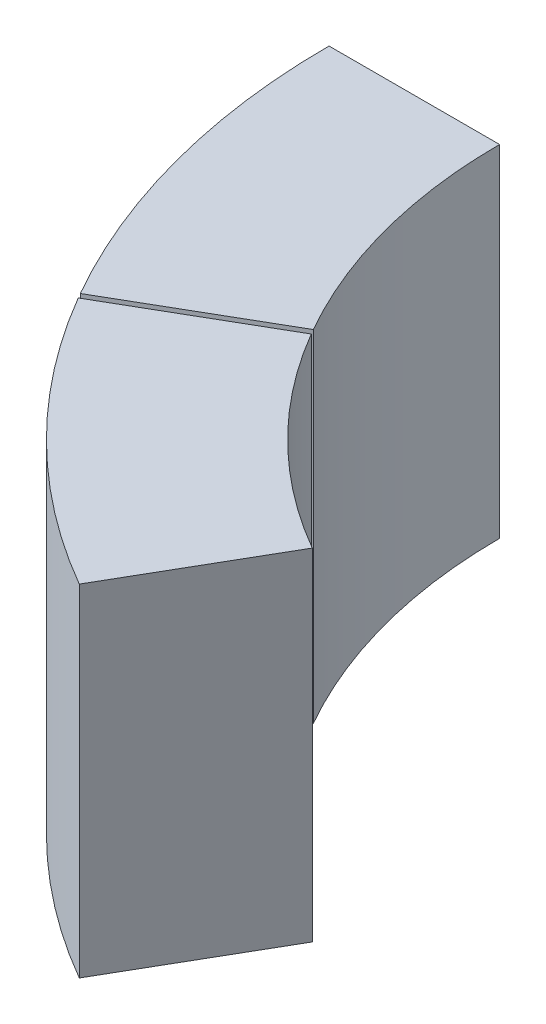
ISO-10303-21;
HEADER;
FILE_DESCRIPTION(('STEP AP214'),'2;1');
FILE_NAME('part.step','',(''),(''),'','','');
FILE_SCHEMA(('AUTOMOTIVE_DESIGN { 1 0 10303 214 1 1 1 1 }'));
ENDSEC;
DATA;
#1=APPLICATION_CONTEXT('core data for automotive mechanical design processes');
#2=APPLICATION_PROTOCOL_DEFINITION('international standard','automotive_design',2000,#1);
#3=PRODUCT_CONTEXT('',#1,'mechanical');
#4=PRODUCT('Part','Part','',(#3));
#5=PRODUCT_RELATED_PRODUCT_CATEGORY('part','',(#4));
#6=PRODUCT_DEFINITION_FORMATION('','',#4);
#7=PRODUCT_DEFINITION_CONTEXT('part definition',#1,'design');
#8=PRODUCT_DEFINITION('design','',#6,#7);
#9=PRODUCT_DEFINITION_SHAPE('','',#8);
#10=(LENGTH_UNIT() NAMED_UNIT(*) SI_UNIT(.MILLI.,.METRE.));
#11=(NAMED_UNIT(*) PLANE_ANGLE_UNIT() SI_UNIT($,.RADIAN.));
#12=(NAMED_UNIT(*) SI_UNIT($,.STERADIAN.) SOLID_ANGLE_UNIT());
#13=UNCERTAINTY_MEASURE_WITH_UNIT(LENGTH_MEASURE(1.E-05),#10,'distance_accuracy_value','');
#14=(GEOMETRIC_REPRESENTATION_CONTEXT(3) GLOBAL_UNCERTAINTY_ASSIGNED_CONTEXT((#13)) GLOBAL_UNIT_ASSIGNED_CONTEXT((#10,
#11,#12)) REPRESENTATION_CONTEXT('',''));
#15=CARTESIAN_POINT('',(0.,0.,0.));
#16=DIRECTION('',(0.,0.,1.));
#17=DIRECTION('',(1.,0.,0.));
#18=AXIS2_PLACEMENT_3D('',#15,#16,#17);
#19=CARTESIAN_POINT('',(0.,600.,0.));
#20=DIRECTION('',(0.,1.,0.));
#21=DIRECTION('',(0.,0.,1.));
#22=AXIS2_PLACEMENT_3D('',#19,#20,#21);
#23=PLANE('',#22);
#24=DIRECTION('',(0.866025403784438,0.,-0.500000000000002));
#25=VECTOR('',#24,1.);
#26=CARTESIAN_POINT('',(-41.4069616942971,600.,29.679823172423));
#27=LINE('',#26,#25);
#28=CARTESIAN_POINT('',(-1036.72146340422,600.,604.324918662985));
#29=VERTEX_POINT('',#28);
#30=CARTESIAN_POINT('',(-776.910835182576,600.,454.323182520895));
#31=VERTEX_POINT('',#30);
#32=EDGE_CURVE('E11',#29,#31,#27,.T.);
#33=ORIENTED_EDGE('',*,*,#32,.F.);
#34=CARTESIAN_POINT('',(0.,600.,0.));
#35=DIRECTION('',(0.,1.,0.));
#36=DIRECTION('',(0.,0.,1.));
#37=AXIS2_PLACEMENT_3D('',#34,#35,#36);
#38=CIRCLE('',#37,1200.);
#39=CARTESIAN_POINT('',(-599.999999999997,600.,1039.23048454133));
#40=VERTEX_POINT('',#39);
#41=EDGE_CURVE('E351',#29,#40,#38,.T.);
#42=ORIENTED_EDGE('',*,*,#41,.T.);
#43=DIRECTION('',(-0.499999999999998,0.,0.86602540378444));
#44=VECTOR('',#43,1.);
#45=CARTESIAN_POINT('',(0.,600.,0.));
#46=LINE('',#45,#44);
#47=CARTESIAN_POINT('',(-449.999999999998,600.,779.422863405996));
#48=VERTEX_POINT('',#47);
#49=EDGE_CURVE('E331',#48,#40,#46,.T.);
#50=ORIENTED_EDGE('',*,*,#49,.F.);
#51=CARTESIAN_POINT('',(0.,600.,0.));
#52=DIRECTION('',(0.,1.,0.));
#53=DIRECTION('',(0.,0.,1.));
#54=AXIS2_PLACEMENT_3D('',#51,#52,#53);
#55=CIRCLE('',#54,900.);
#56=EDGE_CURVE('E311',#31,#48,#55,.T.);
#57=ORIENTED_EDGE('',*,*,#56,.F.);
#58=EDGE_LOOP('',(#33,#42,#50,#57));
#59=FACE_BOUND('',#58,.T.);
#60=ADVANCED_FACE('F42',(#59),#23,.T.);
#61=CARTESIAN_POINT('',(0.,600.,0.));
#62=DIRECTION('',(0.,1.,0.));
#63=DIRECTION('',(0.,0.,1.));
#64=AXIS2_PLACEMENT_3D('',#61,#62,#63);
#65=PLANE('',#64);
#66=DIRECTION('',(-0.866025403784438,0.,0.500000000000002));
#67=VECTOR('',#66,1.);
#68=CARTESIAN_POINT('',(-57.7959078736684,600.,27.5949802770249));
#69=LINE('',#68,#67);
#70=CARTESIAN_POINT('',(-781.910835182575,600.,445.66292848305));
#71=VERTEX_POINT('',#70);
#72=CARTESIAN_POINT('',(-1041.72146340422,600.,595.664664625141));
#73=VERTEX_POINT('',#72);
#74=EDGE_CURVE('E239',#71,#73,#69,.T.);
#75=ORIENTED_EDGE('',*,*,#74,.F.);
#76=CARTESIAN_POINT('',(0.,600.,0.));
#77=DIRECTION('',(0.,1.,0.));
#78=DIRECTION('',(0.,0.,1.));
#79=AXIS2_PLACEMENT_3D('',#76,#77,#78);
#80=CIRCLE('',#79,900.);
#81=CARTESIAN_POINT('',(-900.,600.,0.));
#82=VERTEX_POINT('',#81);
#83=EDGE_CURVE('E251',#82,#71,#80,.T.);
#84=ORIENTED_EDGE('',*,*,#83,.F.);
#85=DIRECTION('',(-1.,0.,0.));
#86=VECTOR('',#85,1.);
#87=CARTESIAN_POINT('',(0.,600.,0.));
#88=LINE('',#87,#86);
#89=CARTESIAN_POINT('',(-1200.,600.,0.));
#90=VERTEX_POINT('',#89);
#91=EDGE_CURVE('E255',#82,#90,#88,.T.);
#92=ORIENTED_EDGE('',*,*,#91,.T.);
#93=CARTESIAN_POINT('',(0.,600.,0.));
#94=DIRECTION('',(0.,1.,0.));
#95=DIRECTION('',(0.,0.,1.));
#96=AXIS2_PLACEMENT_3D('',#93,#94,#95);
#97=CIRCLE('',#96,1200.);
#98=EDGE_CURVE('E259',#90,#73,#97,.T.);
#99=ORIENTED_EDGE('',*,*,#98,.T.);
#100=EDGE_LOOP('',(#75,#84,#92,#99));
#101=FACE_BOUND('',#100,.T.);
#102=ADVANCED_FACE('F611',(#101),#65,.T.);
#103=CARTESIAN_POINT('',(0.,600.,0.));
#104=DIRECTION('',(0.,-1.,0.));
#105=DIRECTION('',(0.,0.,-1.));
#106=AXIS2_PLACEMENT_3D('',#103,#104,#105);
#107=CYLINDRICAL_SURFACE('',#106,900.);
#108=DIRECTION('',(0.,-1.,0.));
#109=VECTOR('',#108,1.);
#110=CARTESIAN_POINT('',(-776.910835182575,600.,454.323182520894));
#111=LINE('',#110,#109);
#112=CARTESIAN_POINT('',(-776.910835182575,0.,454.323182520895));
#113=VERTEX_POINT('',#112);
#114=EDGE_CURVE('E53',#31,#113,#111,.T.);
#115=ORIENTED_EDGE('',*,*,#114,.F.);
#116=ORIENTED_EDGE('',*,*,#56,.T.);
#117=DIRECTION('',(0.,-1.,0.));
#118=VECTOR('',#117,1.);
#119=CARTESIAN_POINT('',(-449.999999999998,600.,779.422863405996));
#120=LINE('',#119,#118);
#121=CARTESIAN_POINT('',(-449.999999999998,0.,779.422863405996));
#122=VERTEX_POINT('',#121);
#123=EDGE_CURVE('E332',#48,#122,#120,.T.);
#124=ORIENTED_EDGE('',*,*,#123,.T.);
#125=CARTESIAN_POINT('',(0.,0.,0.));
#126=DIRECTION('',(0.,1.,0.));
#127=DIRECTION('',(0.,0.,1.));
#128=AXIS2_PLACEMENT_3D('',#125,#126,#127);
#129=CIRCLE('',#128,900.);
#130=EDGE_CURVE('E46',#113,#122,#129,.T.);
#131=ORIENTED_EDGE('',*,*,#130,.F.);
#132=EDGE_LOOP('',(#115,#116,#124,#131));
#133=FACE_BOUND('',#132,.T.);
#134=ADVANCED_FACE('F44',(#133),#107,.F.);
#135=CARTESIAN_POINT('',(0.,600.,0.));
#136=DIRECTION('',(0.,-1.,0.));
#137=DIRECTION('',(0.,0.,-1.));
#138=AXIS2_PLACEMENT_3D('',#135,#136,#137);
#139=CYLINDRICAL_SURFACE('',#138,1200.);
#140=ORIENTED_EDGE('',*,*,#41,.F.);
#141=DIRECTION('',(0.,-1.,0.));
#142=VECTOR('',#141,1.);
#143=CARTESIAN_POINT('',(-1036.72146340422,600.,604.324918662985));
#144=LINE('',#143,#142);
#145=CARTESIAN_POINT('',(-1036.72146340422,0.,604.324918662985));
#146=VERTEX_POINT('',#145);
#147=EDGE_CURVE('E336',#29,#146,#144,.T.);
#148=ORIENTED_EDGE('',*,*,#147,.T.);
#149=CARTESIAN_POINT('',(0.,0.,0.));
#150=DIRECTION('',(0.,1.,0.));
#151=DIRECTION('',(0.,0.,1.));
#152=AXIS2_PLACEMENT_3D('',#149,#150,#151);
#153=CIRCLE('',#152,1200.);
#154=CARTESIAN_POINT('',(-599.999999999997,0.,1039.23048454133));
#155=VERTEX_POINT('',#154);
#156=EDGE_CURVE('E349',#146,#155,#153,.T.);
#157=ORIENTED_EDGE('',*,*,#156,.T.);
#158=DIRECTION('',(0.,-1.,0.));
#159=VECTOR('',#158,1.);
#160=CARTESIAN_POINT('',(-599.999999999997,600.,1039.23048454133));
#161=LINE('',#160,#159);
#162=EDGE_CURVE('E327',#40,#155,#161,.T.);
#163=ORIENTED_EDGE('',*,*,#162,.F.);
#164=EDGE_LOOP('',(#140,#148,#157,#163));
#165=FACE_BOUND('',#164,.T.);
#166=ADVANCED_FACE('F360',(#165),#139,.T.);
#167=CARTESIAN_POINT('',(0.,0.,0.));
#168=DIRECTION('',(0.,1.,0.));
#169=DIRECTION('',(0.,0.,1.));
#170=AXIS2_PLACEMENT_3D('',#167,#168,#169);
#171=PLANE('',#170);
#172=ORIENTED_EDGE('',*,*,#156,.F.);
#173=DIRECTION('',(0.866025403784438,0.,-0.500000000000002));
#174=VECTOR('',#173,1.);
#175=CARTESIAN_POINT('',(2.49999999999987,0.,4.33012701892194));
#176=LINE('',#175,#174);
#177=CARTESIAN_POINT('',(-993.420193214994,0.,579.324918662984));
#178=VERTEX_POINT('',#177);
#179=EDGE_CURVE('E322',#146,#178,#176,.T.);
#180=ORIENTED_EDGE('',*,*,#179,.T.);
#181=CARTESIAN_POINT('',(0.,0.,0.));
#182=DIRECTION('',(0.,-1.,0.));
#183=DIRECTION('',(0.,0.,1.));
#184=AXIS2_PLACEMENT_3D('',#181,#182,#183);
#185=CIRCLE('',#184,1150.00045290043);
#186=CARTESIAN_POINT('',(-998.420193214993,0.,570.664664625141));
#187=VERTEX_POINT('',#186);
#188=EDGE_CURVE('E290',#178,#187,#185,.T.);
#189=ORIENTED_EDGE('',*,*,#188,.T.);
#190=DIRECTION('',(-0.866025403784438,0.,0.500000000000002));
#191=VECTOR('',#190,1.);
#192=CARTESIAN_POINT('',(-2.50000000000012,0.,-4.33012701892238));
#193=LINE('',#192,#191);
#194=CARTESIAN_POINT('',(-1041.72146340422,0.,595.664664625141));
#195=VERTEX_POINT('',#194);
#196=EDGE_CURVE('E279',#187,#195,#193,.T.);
#197=ORIENTED_EDGE('',*,*,#196,.T.);
#198=CARTESIAN_POINT('',(0.,0.,0.));
#199=DIRECTION('',(0.,1.,0.));
#200=DIRECTION('',(0.,0.,1.));
#201=AXIS2_PLACEMENT_3D('',#198,#199,#200);
#202=CIRCLE('',#201,1200.);
#203=CARTESIAN_POINT('',(-1200.,0.,0.));
#204=VERTEX_POINT('',#203);
#205=EDGE_CURVE('E256',#204,#195,#202,.T.);
#206=ORIENTED_EDGE('',*,*,#205,.F.);
#207=DIRECTION('',(-1.,0.,0.));
#208=VECTOR('',#207,1.);
#209=CARTESIAN_POINT('',(0.,0.,0.));
#210=LINE('',#209,#208);
#211=CARTESIAN_POINT('',(-900.,0.,0.));
#212=VERTEX_POINT('',#211);
#213=EDGE_CURVE('E267',#212,#204,#210,.T.);
#214=ORIENTED_EDGE('',*,*,#213,.F.);
#215=CARTESIAN_POINT('',(0.,0.,0.));
#216=DIRECTION('',(0.,1.,0.));
#217=DIRECTION('',(0.,0.,1.));
#218=AXIS2_PLACEMENT_3D('',#215,#216,#217);
#219=CIRCLE('',#218,900.);
#220=CARTESIAN_POINT('',(-781.910835182575,0.,445.66292848305));
#221=VERTEX_POINT('',#220);
#222=EDGE_CURVE('E250',#212,#221,#219,.T.);
#223=ORIENTED_EDGE('',*,*,#222,.T.);
#224=CARTESIAN_POINT('',(-825.212105371797,0.,470.66292848305));
#225=VERTEX_POINT('',#224);
#226=EDGE_CURVE('E280',#221,#225,#193,.T.);
#227=ORIENTED_EDGE('',*,*,#226,.T.);
#228=CARTESIAN_POINT('',(0.,0.,0.));
#229=DIRECTION('',(0.,1.,0.));
#230=DIRECTION('',(0.,0.,1.));
#231=AXIS2_PLACEMENT_3D('',#228,#229,#230);
#232=CIRCLE('',#231,949.999268999926);
#233=CARTESIAN_POINT('',(-820.212105371797,0.,479.323182520895));
#234=VERTEX_POINT('',#233);
#235=EDGE_CURVE('E284',#225,#234,#232,.T.);
#236=ORIENTED_EDGE('',*,*,#235,.T.);
#237=EDGE_CURVE('E326',#234,#113,#176,.T.);
#238=ORIENTED_EDGE('',*,*,#237,.T.);
#239=ORIENTED_EDGE('',*,*,#130,.T.);
#240=DIRECTION('',(-0.499999999999998,0.,0.86602540378444));
#241=VECTOR('',#240,1.);
#242=CARTESIAN_POINT('',(0.,0.,0.));
#243=LINE('',#242,#241);
#244=EDGE_CURVE('E337',#122,#155,#243,.T.);
#245=ORIENTED_EDGE('',*,*,#244,.T.);
#246=EDGE_LOOP('',(#172,#180,#189,#197,#206,#214,#223,#227,#236,#238,#239,#245));
#247=FACE_BOUND('',#246,.T.);
#248=ADVANCED_FACE('F367',(#247),#171,.F.);
#249=CARTESIAN_POINT('',(0.,600.,0.));
#250=DIRECTION('',(0.86602540378444,0.,0.499999999999998));
#251=DIRECTION('',(0.499999999999998,0.,-0.86602540378444));
#252=AXIS2_PLACEMENT_3D('',#249,#250,#251);
#253=PLANE('',#252);
#254=ORIENTED_EDGE('',*,*,#244,.F.);
#255=ORIENTED_EDGE('',*,*,#123,.F.);
#256=ORIENTED_EDGE('',*,*,#49,.T.);
#257=ORIENTED_EDGE('',*,*,#162,.T.);
#258=EDGE_LOOP('',(#254,#255,#256,#257));
#259=FACE_BOUND('',#258,.T.);
#260=ADVANCED_FACE('F364',(#259),#253,.T.);
#261=CARTESIAN_POINT('',(-41.4069616942971,0.,29.679823172423));
#262=DIRECTION('',(0.500000000000002,0.,0.866025403784438));
#263=DIRECTION('',(0.866025403784438,0.,-0.500000000000002));
#264=AXIS2_PLACEMENT_3D('',#261,#262,#263);
#265=PLANE('',#264);
#266=ORIENTED_EDGE('',*,*,#237,.F.);
#267=DIRECTION('',(0.,-1.,0.));
#268=VECTOR('',#267,1.);
#269=CARTESIAN_POINT('',(-820.212105371797,100.,479.323182520895));
#270=LINE('',#269,#268);
#271=CARTESIAN_POINT('',(-820.212105371797,100.,479.323182520895));
#272=VERTEX_POINT('',#271);
#273=EDGE_CURVE('E301',#272,#234,#270,.T.);
#274=ORIENTED_EDGE('',*,*,#273,.F.);
#275=DIRECTION('',(-0.866025403784438,0.,0.500000000000001));
#276=VECTOR('',#275,1.);
#277=CARTESIAN_POINT('',(-820.212105371797,100.,479.323182520895));
#278=LINE('',#277,#276);
#279=CARTESIAN_POINT('',(-993.420193214994,100.,579.324918662984));
#280=VERTEX_POINT('',#279);
#281=EDGE_CURVE('E289',#272,#280,#278,.T.);
#282=ORIENTED_EDGE('',*,*,#281,.T.);
#283=DIRECTION('',(0.,-1.,0.));
#284=VECTOR('',#283,1.);
#285=CARTESIAN_POINT('',(-993.420193214994,100.,579.324918662984));
#286=LINE('',#285,#284);
#287=EDGE_CURVE('E315',#280,#178,#286,.T.);
#288=ORIENTED_EDGE('',*,*,#287,.T.);
#289=ORIENTED_EDGE('',*,*,#179,.F.);
#290=ORIENTED_EDGE('',*,*,#147,.F.);
#291=ORIENTED_EDGE('',*,*,#32,.T.);
#292=ORIENTED_EDGE('',*,*,#114,.T.);
#293=EDGE_LOOP('',(#266,#274,#282,#288,#289,#290,#291,#292));
#294=FACE_BOUND('',#293,.T.);
#295=ADVANCED_FACE('F377',(#294),#265,.F.);
#296=CARTESIAN_POINT('',(0.,100.,0.));
#297=DIRECTION('',(0.,-1.,0.));
#298=DIRECTION('',(0.,0.,-1.));
#299=AXIS2_PLACEMENT_3D('',#296,#297,#298);
#300=CYLINDRICAL_SURFACE('',#299,949.999268999926);
#301=ORIENTED_EDGE('',*,*,#235,.F.);
#302=DIRECTION('',(0.,-1.,0.));
#303=VECTOR('',#302,1.);
#304=CARTESIAN_POINT('',(-825.212105371797,100.,470.66292848305));
#305=LINE('',#304,#303);
#306=CARTESIAN_POINT('',(-825.212105371797,100.,470.66292848305));
#307=VERTEX_POINT('',#306);
#308=EDGE_CURVE('E307',#307,#225,#305,.T.);
#309=ORIENTED_EDGE('',*,*,#308,.F.);
#310=CARTESIAN_POINT('',(0.,100.,0.));
#311=DIRECTION('',(0.,1.,0.));
#312=DIRECTION('',(0.,0.,1.));
#313=AXIS2_PLACEMENT_3D('',#310,#311,#312);
#314=CIRCLE('',#313,949.999268999926);
#315=EDGE_CURVE('E285',#307,#272,#314,.T.);
#316=ORIENTED_EDGE('',*,*,#315,.T.);
#317=ORIENTED_EDGE('',*,*,#273,.T.);
#318=EDGE_LOOP('',(#301,#309,#316,#317));
#319=FACE_BOUND('',#318,.T.);
#320=ADVANCED_FACE('F659',(#319),#300,.F.);
#321=CARTESIAN_POINT('',(0.,100.,0.));
#322=DIRECTION('',(0.,-1.,0.));
#323=DIRECTION('',(0.,0.,-1.));
#324=AXIS2_PLACEMENT_3D('',#321,#322,#323);
#325=CYLINDRICAL_SURFACE('',#324,1150.00045290043);
#326=ORIENTED_EDGE('',*,*,#188,.F.);
#327=ORIENTED_EDGE('',*,*,#287,.F.);
#328=CARTESIAN_POINT('',(0.,100.,0.));
#329=DIRECTION('',(0.,-1.,0.));
#330=DIRECTION('',(0.,0.,1.));
#331=AXIS2_PLACEMENT_3D('',#328,#329,#330);
#332=CIRCLE('',#331,1150.00045290043);
#333=CARTESIAN_POINT('',(-998.420193214993,100.,570.664664625141));
#334=VERTEX_POINT('',#333);
#335=EDGE_CURVE('E294',#280,#334,#332,.T.);
#336=ORIENTED_EDGE('',*,*,#335,.T.);
#337=DIRECTION('',(0.,-1.,0.));
#338=VECTOR('',#337,1.);
#339=CARTESIAN_POINT('',(-998.420193214993,100.,570.664664625141));
#340=LINE('',#339,#338);
#341=EDGE_CURVE('E312',#334,#187,#340,.T.);
#342=ORIENTED_EDGE('',*,*,#341,.T.);
#343=EDGE_LOOP('',(#326,#327,#336,#342));
#344=FACE_BOUND('',#343,.T.);
#345=ADVANCED_FACE('F666',(#344),#325,.T.);
#346=CARTESIAN_POINT('',(0.,100.,0.));
#347=DIRECTION('',(0.,1.,0.));
#348=DIRECTION('',(0.,0.,1.));
#349=AXIS2_PLACEMENT_3D('',#346,#347,#348);
#350=PLANE('',#349);
#351=ORIENTED_EDGE('',*,*,#315,.F.);
#352=DIRECTION('',(0.866025403784437,0.,-0.500000000000003));
#353=VECTOR('',#352,1.);
#354=CARTESIAN_POINT('',(-825.212105371797,100.,470.66292848305));
#355=LINE('',#354,#353);
#356=EDGE_CURVE('E297',#334,#307,#355,.T.);
#357=ORIENTED_EDGE('',*,*,#356,.F.);
#358=ORIENTED_EDGE('',*,*,#335,.F.);
#359=ORIENTED_EDGE('',*,*,#281,.F.);
#360=EDGE_LOOP('',(#351,#357,#358,#359));
#361=FACE_BOUND('',#360,.T.);
#362=ADVANCED_FACE('F674',(#361),#350,.T.);
#363=CARTESIAN_POINT('',(0.,600.,0.));
#364=DIRECTION('',(0.,0.,1.));
#365=DIRECTION('',(1.,0.,0.));
#366=AXIS2_PLACEMENT_3D('',#363,#364,#365);
#367=PLANE('',#366);
#368=ORIENTED_EDGE('',*,*,#213,.T.);
#369=DIRECTION('',(0.,-1.,0.));
#370=VECTOR('',#369,1.);
#371=CARTESIAN_POINT('',(-1200.,600.,0.));
#372=LINE('',#371,#370);
#373=EDGE_CURVE('E263',#90,#204,#372,.T.);
#374=ORIENTED_EDGE('',*,*,#373,.F.);
#375=ORIENTED_EDGE('',*,*,#91,.F.);
#376=DIRECTION('',(0.,-1.,0.));
#377=VECTOR('',#376,1.);
#378=CARTESIAN_POINT('',(-900.,600.,0.));
#379=LINE('',#378,#377);
#380=EDGE_CURVE('E276',#82,#212,#379,.T.);
#381=ORIENTED_EDGE('',*,*,#380,.T.);
#382=EDGE_LOOP('',(#368,#374,#375,#381));
#383=FACE_BOUND('',#382,.T.);
#384=ADVANCED_FACE('F681',(#383),#367,.F.);
#385=CARTESIAN_POINT('',(0.,600.,0.));
#386=DIRECTION('',(0.,-1.,0.));
#387=DIRECTION('',(0.,0.,-1.));
#388=AXIS2_PLACEMENT_3D('',#385,#386,#387);
#389=CYLINDRICAL_SURFACE('',#388,1200.);
#390=ORIENTED_EDGE('',*,*,#205,.T.);
#391=DIRECTION('',(0.,-1.,0.));
#392=VECTOR('',#391,1.);
#393=CARTESIAN_POINT('',(-1041.72146340422,600.,595.66466462514));
#394=LINE('',#393,#392);
#395=EDGE_CURVE('E242',#195,#73,#394,.F.);
#396=ORIENTED_EDGE('',*,*,#395,.T.);
#397=ORIENTED_EDGE('',*,*,#98,.F.);
#398=ORIENTED_EDGE('',*,*,#373,.T.);
#399=EDGE_LOOP('',(#390,#396,#397,#398));
#400=FACE_BOUND('',#399,.T.);
#401=ADVANCED_FACE('F688',(#400),#389,.T.);
#402=CARTESIAN_POINT('',(0.,600.,0.));
#403=DIRECTION('',(0.,-1.,0.));
#404=DIRECTION('',(0.,0.,-1.));
#405=AXIS2_PLACEMENT_3D('',#402,#403,#404);
#406=CYLINDRICAL_SURFACE('',#405,900.);
#407=DIRECTION('',(0.,-1.,0.));
#408=VECTOR('',#407,1.);
#409=CARTESIAN_POINT('',(-781.910835182575,600.,445.66292848305));
#410=LINE('',#409,#408);
#411=EDGE_CURVE('E247',#221,#71,#410,.F.);
#412=ORIENTED_EDGE('',*,*,#411,.F.);
#413=ORIENTED_EDGE('',*,*,#222,.F.);
#414=ORIENTED_EDGE('',*,*,#380,.F.);
#415=ORIENTED_EDGE('',*,*,#83,.T.);
#416=EDGE_LOOP('',(#412,#413,#414,#415));
#417=FACE_BOUND('',#416,.T.);
#418=ADVANCED_FACE('F696',(#417),#406,.F.);
#419=CARTESIAN_POINT('',(-57.7959078736684,0.,27.5949802770249));
#420=DIRECTION('',(-0.500000000000002,0.,-0.866025403784438));
#421=DIRECTION('',(-0.866025403784438,0.,0.500000000000002));
#422=AXIS2_PLACEMENT_3D('',#419,#420,#421);
#423=PLANE('',#422);
#424=ORIENTED_EDGE('',*,*,#308,.T.);
#425=ORIENTED_EDGE('',*,*,#226,.F.);
#426=ORIENTED_EDGE('',*,*,#411,.T.);
#427=ORIENTED_EDGE('',*,*,#74,.T.);
#428=ORIENTED_EDGE('',*,*,#395,.F.);
#429=ORIENTED_EDGE('',*,*,#196,.F.);
#430=ORIENTED_EDGE('',*,*,#341,.F.);
#431=ORIENTED_EDGE('',*,*,#356,.T.);
#432=EDGE_LOOP('',(#424,#425,#426,#427,#428,#429,#430,#431));
#433=FACE_BOUND('',#432,.T.);
#434=ADVANCED_FACE('F384',(#433),#423,.F.);
#435=CLOSED_SHELL('',(#60,#102,#134,#166,#248,#260,#295,#320,#345,#362,#384,#401,#418,#434));
#436=CARTESIAN_POINT('',(0.,590.,0.));
#437=DIRECTION('',(0.,1.,0.));
#438=DIRECTION('',(0.,0.,1.));
#439=AXIS2_PLACEMENT_3D('',#436,#437,#438);
#440=PLANE('',#439);
#441=CARTESIAN_POINT('',(0.,590.,0.));
#442=DIRECTION('',(0.,-1.,0.));
#443=DIRECTION('',(0.,0.,1.));
#444=AXIS2_PLACEMENT_3D('',#441,#442,#443);
#445=CIRCLE('',#444,910.);
#446=CARTESIAN_POINT('',(-463.632780680936,590.,783.035532193823));
#447=VERTEX_POINT('',#446);
#448=CARTESIAN_POINT('',(-780.47604659025,590.,467.928563670626));
#449=VERTEX_POINT('',#448);
#450=EDGE_CURVE('E491',#447,#449,#445,.T.);
#451=ORIENTED_EDGE('',*,*,#450,.F.);
#452=DIRECTION('',(0.499999999999998,0.,-0.86602540378444));
#453=VECTOR('',#452,1.);
#454=CARTESIAN_POINT('',(-463.632780680936,590.,783.035532193823));
#455=LINE('',#454,#453);
#456=CARTESIAN_POINT('',(-603.639245263582,590.,1025.53384223906));
#457=VERTEX_POINT('',#456);
#458=EDGE_CURVE('E467',#457,#447,#455,.T.);
#459=ORIENTED_EDGE('',*,*,#458,.F.);
#460=CARTESIAN_POINT('',(0.,590.,0.));
#461=DIRECTION('',(0.,1.,0.));
#462=DIRECTION('',(0.,0.,1.));
#463=AXIS2_PLACEMENT_3D('',#460,#461,#462);
#464=CIRCLE('',#463,1190.);
#465=CARTESIAN_POINT('',(-1022.9883551016,590.,607.943110271451));
#466=VERTEX_POINT('',#465);
#467=EDGE_CURVE('E69',#466,#457,#464,.T.);
#468=ORIENTED_EDGE('',*,*,#467,.F.);
#469=DIRECTION('',(-0.866025403784438,0.,0.500000000000002));
#470=VECTOR('',#469,1.);
#471=CARTESIAN_POINT('',(-1022.9883551016,590.,607.943110271451));
#472=LINE('',#471,#470);
#473=EDGE_CURVE('E476',#449,#466,#472,.T.);
#474=ORIENTED_EDGE('',*,*,#473,.F.);
#475=EDGE_LOOP('',(#451,#459,#468,#474));
#476=FACE_BOUND('',#475,.T.);
#477=ADVANCED_FACE('F534',(#476),#440,.F.);
#478=CARTESIAN_POINT('',(-36.4069616942971,0.,38.3400772102674));
#479=DIRECTION('',(0.500000000000002,0.,0.866025403784438));
#480=DIRECTION('',(0.866025403784438,0.,-0.500000000000002));
#481=AXIS2_PLACEMENT_3D('',#478,#479,#480);
#482=PLANE('',#481);
#483=DIRECTION('',(0.,-1.,0.));
#484=VECTOR('',#483,1.);
#485=CARTESIAN_POINT('',(-780.47604659025,600.,467.928563670626));
#486=LINE('',#485,#484);
#487=CARTESIAN_POINT('',(-780.47604659025,10.,467.928563670626));
#488=VERTEX_POINT('',#487);
#489=EDGE_CURVE('E243',#449,#488,#486,.T.);
#490=ORIENTED_EDGE('',*,*,#489,.F.);
#491=ORIENTED_EDGE('',*,*,#473,.T.);
#492=DIRECTION('',(0.,-1.,0.));
#493=VECTOR('',#492,1.);
#494=CARTESIAN_POINT('',(-1022.9883551016,600.,607.943110271451));
#495=LINE('',#494,#493);
#496=CARTESIAN_POINT('',(-1022.9883551016,10.,607.943110271451));
#497=VERTEX_POINT('',#496);
#498=EDGE_CURVE('E411',#466,#497,#495,.T.);
#499=ORIENTED_EDGE('',*,*,#498,.T.);
#500=DIRECTION('',(0.866025403784438,0.,-0.500000000000002));
#501=VECTOR('',#500,1.);
#502=CARTESIAN_POINT('',(7.49999999999988,10.,12.9903810567663));
#503=LINE('',#502,#501);
#504=CARTESIAN_POINT('',(-979.683885838846,10.,582.941263285487));
#505=VERTEX_POINT('',#504);
#506=EDGE_CURVE('E399',#497,#505,#503,.T.);
#507=ORIENTED_EDGE('',*,*,#506,.T.);
#508=DIRECTION('',(0.,-1.,0.));
#509=VECTOR('',#508,1.);
#510=CARTESIAN_POINT('',(-979.683885838846,90.,582.941263285487));
#511=LINE('',#510,#509);
#512=CARTESIAN_POINT('',(-979.683885838846,90.,582.941263285487));
#513=VERTEX_POINT('',#512);
#514=EDGE_CURVE('E424',#513,#505,#511,.T.);
#515=ORIENTED_EDGE('',*,*,#514,.F.);
#516=DIRECTION('',(-0.866025403784438,0.,0.500000000000002));
#517=VECTOR('',#516,1.);
#518=CARTESIAN_POINT('',(-36.4069616942971,90.,38.3400772102674));
#519=LINE('',#518,#517);
#520=CARTESIAN_POINT('',(-823.782260944075,90.,492.931418185391));
#521=VERTEX_POINT('',#520);
#522=EDGE_CURVE('E439',#521,#513,#519,.T.);
#523=ORIENTED_EDGE('',*,*,#522,.F.);
#524=DIRECTION('',(0.,-1.,0.));
#525=VECTOR('',#524,1.);
#526=CARTESIAN_POINT('',(-823.782260944075,90.,492.931418185391));
#527=LINE('',#526,#525);
#528=CARTESIAN_POINT('',(-823.782260944075,10.,492.931418185391));
#529=VERTEX_POINT('',#528);
#530=EDGE_CURVE('E428',#521,#529,#527,.T.);
#531=ORIENTED_EDGE('',*,*,#530,.T.);
#532=DIRECTION('',(0.866025403784438,0.,-0.500000000000002));
#533=VECTOR('',#532,1.);
#534=CARTESIAN_POINT('',(7.49999999999988,10.,12.9903810567663));
#535=LINE('',#534,#533);
#536=EDGE_CURVE('E403',#529,#488,#535,.T.);
#537=ORIENTED_EDGE('',*,*,#536,.T.);
#538=EDGE_LOOP('',(#490,#491,#499,#507,#515,#523,#531,#537));
#539=FACE_BOUND('',#538,.T.);
#540=ADVANCED_FACE('F502',(#539),#482,.T.);
#541=CARTESIAN_POINT('',(0.,600.,0.));
#542=DIRECTION('',(0.,-1.,0.));
#543=DIRECTION('',(0.,0.,-1.));
#544=AXIS2_PLACEMENT_3D('',#541,#542,#543);
#545=CYLINDRICAL_SURFACE('',#544,910.);
#546=ORIENTED_EDGE('',*,*,#450,.T.);
#547=ORIENTED_EDGE('',*,*,#489,.T.);
#548=CARTESIAN_POINT('',(0.,10.,0.));
#549=DIRECTION('',(0.,1.,0.));
#550=DIRECTION('',(0.,0.,1.));
#551=AXIS2_PLACEMENT_3D('',#548,#549,#550);
#552=CIRCLE('',#551,910.);
#553=CARTESIAN_POINT('',(-463.632780680936,10.,783.035532193823));
#554=VERTEX_POINT('',#553);
#555=EDGE_CURVE('E395',#488,#554,#552,.T.);
#556=ORIENTED_EDGE('',*,*,#555,.T.);
#557=DIRECTION('',(0.,-1.,0.));
#558=VECTOR('',#557,1.);
#559=CARTESIAN_POINT('',(-463.632780680936,600.,783.035532193823));
#560=LINE('',#559,#558);
#561=EDGE_CURVE('E414',#447,#554,#560,.T.);
#562=ORIENTED_EDGE('',*,*,#561,.F.);
#563=EDGE_LOOP('',(#546,#547,#556,#562));
#564=FACE_BOUND('',#563,.T.);
#565=ADVANCED_FACE('F511',(#564),#545,.T.);
#566=CARTESIAN_POINT('',(-8.6602540378444,600.,-4.99999999999998));
#567=DIRECTION('',(0.86602540378444,0.,0.499999999999998));
#568=DIRECTION('',(0.499999999999998,0.,-0.86602540378444));
#569=AXIS2_PLACEMENT_3D('',#566,#567,#568);
#570=PLANE('',#569);
#571=ORIENTED_EDGE('',*,*,#458,.T.);
#572=ORIENTED_EDGE('',*,*,#561,.T.);
#573=DIRECTION('',(-0.499999999999998,0.,0.86602540378444));
#574=VECTOR('',#573,1.);
#575=CARTESIAN_POINT('',(-8.6602540378444,10.,-4.99999999999998));
#576=LINE('',#575,#574);
#577=CARTESIAN_POINT('',(-603.639245263582,10.,1025.53384223906));
#578=VERTEX_POINT('',#577);
#579=EDGE_CURVE('E391',#554,#578,#576,.T.);
#580=ORIENTED_EDGE('',*,*,#579,.T.);
#581=DIRECTION('',(0.,-1.,0.));
#582=VECTOR('',#581,1.);
#583=CARTESIAN_POINT('',(-603.639245263582,600.,1025.53384223906));
#584=LINE('',#583,#582);
#585=EDGE_CURVE('E388',#457,#578,#584,.T.);
#586=ORIENTED_EDGE('',*,*,#585,.F.);
#587=EDGE_LOOP('',(#571,#572,#580,#586));
#588=FACE_BOUND('',#587,.T.);
#589=ADVANCED_FACE('F509',(#588),#570,.F.);
#590=CARTESIAN_POINT('',(0.,600.,0.));
#591=DIRECTION('',(0.,-1.,0.));
#592=DIRECTION('',(0.,0.,-1.));
#593=AXIS2_PLACEMENT_3D('',#590,#591,#592);
#594=CYLINDRICAL_SURFACE('',#593,1190.);
#595=ORIENTED_EDGE('',*,*,#498,.F.);
#596=ORIENTED_EDGE('',*,*,#467,.T.);
#597=ORIENTED_EDGE('',*,*,#585,.T.);
#598=CARTESIAN_POINT('',(0.,10.,0.));
#599=DIRECTION('',(0.,1.,0.));
#600=DIRECTION('',(0.,0.,1.));
#601=AXIS2_PLACEMENT_3D('',#598,#599,#600);
#602=CIRCLE('',#601,1190.);
#603=EDGE_CURVE('E407',#497,#578,#602,.T.);
#604=ORIENTED_EDGE('',*,*,#603,.F.);
#605=EDGE_LOOP('',(#595,#596,#597,#604));
#606=FACE_BOUND('',#605,.T.);
#607=ADVANCED_FACE('F506',(#606),#594,.F.);
#608=CARTESIAN_POINT('',(0.,100.,0.));
#609=DIRECTION('',(0.,-1.,0.));
#610=DIRECTION('',(0.,0.,-1.));
#611=AXIS2_PLACEMENT_3D('',#608,#609,#610);
#612=CYLINDRICAL_SURFACE('',#611,1140.00045290043);
#613=CARTESIAN_POINT('',(0.,9.99999999999999,0.));
#614=DIRECTION('',(0.,1.,0.));
#615=DIRECTION('',(0.,0.,1.));
#616=AXIS2_PLACEMENT_3D('',#613,#614,#615);
#617=CIRCLE('',#616,1140.00045290043);
#618=CARTESIAN_POINT('',(-994.683885838846,10.,556.960501171954));
#619=VERTEX_POINT('',#618);
#620=EDGE_CURVE('E447',#505,#619,#617,.F.);
#621=ORIENTED_EDGE('',*,*,#620,.T.);
#622=DIRECTION('',(0.,-1.,0.));
#623=VECTOR('',#622,1.);
#624=CARTESIAN_POINT('',(-994.683885838846,90.,556.960501171954));
#625=LINE('',#624,#623);
#626=CARTESIAN_POINT('',(-994.683885838846,90.,556.960501171954));
#627=VERTEX_POINT('',#626);
#628=EDGE_CURVE('E421',#627,#619,#625,.T.);
#629=ORIENTED_EDGE('',*,*,#628,.F.);
#630=CARTESIAN_POINT('',(0.,90.,0.));
#631=DIRECTION('',(0.,1.,0.));
#632=DIRECTION('',(0.,0.,1.));
#633=AXIS2_PLACEMENT_3D('',#630,#631,#632);
#634=CIRCLE('',#633,1140.00045290043);
#635=EDGE_CURVE('E436',#513,#627,#634,.F.);
#636=ORIENTED_EDGE('',*,*,#635,.F.);
#637=ORIENTED_EDGE('',*,*,#514,.T.);
#638=EDGE_LOOP('',(#621,#629,#636,#637));
#639=FACE_BOUND('',#638,.T.);
#640=ADVANCED_FACE('F521',(#639),#612,.F.);
#641=CARTESIAN_POINT('',(0.,90.,0.));
#642=DIRECTION('',(0.,1.,0.));
#643=DIRECTION('',(0.,0.,1.));
#644=AXIS2_PLACEMENT_3D('',#641,#642,#643);
#645=PLANE('',#644);
#646=CARTESIAN_POINT('',(0.,90.,0.));
#647=DIRECTION('',(0.,1.,0.));
#648=DIRECTION('',(0.,0.,1.));
#649=AXIS2_PLACEMENT_3D('',#646,#647,#648);
#650=CIRCLE('',#649,959.999268999926);
#651=CARTESIAN_POINT('',(-838.782260944075,90.,466.950656071858));
#652=VERTEX_POINT('',#651);
#653=EDGE_CURVE('E443',#652,#521,#650,.T.);
#654=ORIENTED_EDGE('',*,*,#653,.T.);
#655=ORIENTED_EDGE('',*,*,#522,.T.);
#656=ORIENTED_EDGE('',*,*,#635,.T.);
#657=DIRECTION('',(0.866025403784438,0.,-0.500000000000002));
#658=VECTOR('',#657,1.);
#659=CARTESIAN_POINT('',(-62.7959078736685,90.,18.9347262391805));
#660=LINE('',#659,#658);
#661=EDGE_CURVE('E432',#627,#652,#660,.T.);
#662=ORIENTED_EDGE('',*,*,#661,.T.);
#663=EDGE_LOOP('',(#654,#655,#656,#662));
#664=FACE_BOUND('',#663,.T.);
#665=ADVANCED_FACE('F518',(#664),#645,.F.);
#666=CARTESIAN_POINT('',(0.,100.,0.));
#667=DIRECTION('',(0.,-1.,0.));
#668=DIRECTION('',(0.,0.,-1.));
#669=AXIS2_PLACEMENT_3D('',#666,#667,#668);
#670=CYLINDRICAL_SURFACE('',#669,959.999268999926);
#671=CARTESIAN_POINT('',(0.,9.99999999999999,0.));
#672=DIRECTION('',(0.,1.,0.));
#673=DIRECTION('',(0.,0.,1.));
#674=AXIS2_PLACEMENT_3D('',#671,#672,#673);
#675=CIRCLE('',#674,959.999268999926);
#676=CARTESIAN_POINT('',(-838.782260944075,10.,466.950656071858));
#677=VERTEX_POINT('',#676);
#678=EDGE_CURVE('E451',#677,#529,#675,.T.);
#679=ORIENTED_EDGE('',*,*,#678,.T.);
#680=ORIENTED_EDGE('',*,*,#530,.F.);
#681=ORIENTED_EDGE('',*,*,#653,.F.);
#682=DIRECTION('',(0.,-1.,0.));
#683=VECTOR('',#682,1.);
#684=CARTESIAN_POINT('',(-838.782260944075,90.,466.950656071858));
#685=LINE('',#684,#683);
#686=EDGE_CURVE('E417',#652,#677,#685,.T.);
#687=ORIENTED_EDGE('',*,*,#686,.T.);
#688=EDGE_LOOP('',(#679,#680,#681,#687));
#689=FACE_BOUND('',#688,.T.);
#690=ADVANCED_FACE('F514',(#689),#670,.T.);
#691=CARTESIAN_POINT('',(0.,10.,0.));
#692=DIRECTION('',(0.,1.,0.));
#693=DIRECTION('',(0.,0.,1.));
#694=AXIS2_PLACEMENT_3D('',#691,#692,#693);
#695=PLANE('',#694);
#696=ORIENTED_EDGE('',*,*,#603,.T.);
#697=ORIENTED_EDGE('',*,*,#579,.F.);
#698=ORIENTED_EDGE('',*,*,#555,.F.);
#699=ORIENTED_EDGE('',*,*,#536,.F.);
#700=ORIENTED_EDGE('',*,*,#678,.F.);
#701=DIRECTION('',(-0.866025403784438,0.,0.500000000000002));
#702=VECTOR('',#701,1.);
#703=CARTESIAN_POINT('',(-7.50000000000014,10.,-12.9903810567668));
#704=LINE('',#703,#702);
#705=CARTESIAN_POINT('',(-795.47604659025,10.,441.947801557093));
#706=VERTEX_POINT('',#705);
#707=EDGE_CURVE('E233',#706,#677,#704,.T.);
#708=ORIENTED_EDGE('',*,*,#707,.F.);
#709=CARTESIAN_POINT('',(0.,10.,0.));
#710=DIRECTION('',(0.,1.,0.));
#711=DIRECTION('',(0.,0.,1.));
#712=AXIS2_PLACEMENT_3D('',#709,#710,#711);
#713=CIRCLE('',#712,910.);
#714=CARTESIAN_POINT('',(-909.945053286186,10.,10.));
#715=VERTEX_POINT('',#714);
#716=EDGE_CURVE('E460',#715,#706,#713,.T.);
#717=ORIENTED_EDGE('',*,*,#716,.F.);
#718=DIRECTION('',(-1.,0.,0.));
#719=VECTOR('',#718,1.);
#720=CARTESIAN_POINT('',(0.,10.,10.));
#721=LINE('',#720,#719);
#722=CARTESIAN_POINT('',(-1189.95798245148,10.,10.));
#723=VERTEX_POINT('',#722);
#724=EDGE_CURVE('E225',#715,#723,#721,.T.);
#725=ORIENTED_EDGE('',*,*,#724,.T.);
#726=CARTESIAN_POINT('',(0.,10.,0.));
#727=DIRECTION('',(0.,1.,0.));
#728=DIRECTION('',(0.,0.,1.));
#729=AXIS2_PLACEMENT_3D('',#726,#727,#728);
#730=CIRCLE('',#729,1190.);
#731=CARTESIAN_POINT('',(-1037.9883551016,10.,581.962348157918));
#732=VERTEX_POINT('',#731);
#733=EDGE_CURVE('E235',#723,#732,#730,.T.);
#734=ORIENTED_EDGE('',*,*,#733,.T.);
#735=DIRECTION('',(-0.866025403784438,0.,0.500000000000002));
#736=VECTOR('',#735,1.);
#737=CARTESIAN_POINT('',(-7.50000000000014,10.,-12.9903810567668));
#738=LINE('',#737,#736);
#739=EDGE_CURVE('E228',#619,#732,#738,.T.);
#740=ORIENTED_EDGE('',*,*,#739,.F.);
#741=ORIENTED_EDGE('',*,*,#620,.F.);
#742=ORIENTED_EDGE('',*,*,#506,.F.);
#743=EDGE_LOOP('',(#696,#697,#698,#699,#700,#708,#717,#725,#734,#740,#741,#742));
#744=FACE_BOUND('',#743,.T.);
#745=ADVANCED_FACE('F486',(#744),#695,.T.);
#746=CARTESIAN_POINT('',(-62.7959078736685,0.,18.9347262391805));
#747=DIRECTION('',(-0.500000000000002,0.,-0.866025403784438));
#748=DIRECTION('',(-0.866025403784438,0.,0.500000000000002));
#749=AXIS2_PLACEMENT_3D('',#746,#747,#748);
#750=PLANE('',#749);
#751=DIRECTION('',(0.,-1.,0.));
#752=VECTOR('',#751,1.);
#753=CARTESIAN_POINT('',(-1037.9883551016,10.,581.962348157918));
#754=LINE('',#753,#752);
#755=CARTESIAN_POINT('',(-1037.9883551016,590.,581.962348157918));
#756=VERTEX_POINT('',#755);
#757=EDGE_CURVE('E464',#732,#756,#754,.F.);
#758=ORIENTED_EDGE('',*,*,#757,.T.);
#759=DIRECTION('',(0.866025403784438,0.,-0.500000000000002));
#760=VECTOR('',#759,1.);
#761=CARTESIAN_POINT('',(-795.47604659025,590.,441.947801557093));
#762=LINE('',#761,#760);
#763=CARTESIAN_POINT('',(-795.47604659025,590.,441.947801557093));
#764=VERTEX_POINT('',#763);
#765=EDGE_CURVE('E489',#756,#764,#762,.T.);
#766=ORIENTED_EDGE('',*,*,#765,.T.);
#767=DIRECTION('',(0.,-1.,0.));
#768=VECTOR('',#767,1.);
#769=CARTESIAN_POINT('',(-795.47604659025,10.,441.947801557093));
#770=LINE('',#769,#768);
#771=EDGE_CURVE('E220',#706,#764,#770,.F.);
#772=ORIENTED_EDGE('',*,*,#771,.F.);
#773=ORIENTED_EDGE('',*,*,#707,.T.);
#774=ORIENTED_EDGE('',*,*,#686,.F.);
#775=ORIENTED_EDGE('',*,*,#661,.F.);
#776=ORIENTED_EDGE('',*,*,#628,.T.);
#777=ORIENTED_EDGE('',*,*,#739,.T.);
#778=EDGE_LOOP('',(#758,#766,#772,#773,#774,#775,#776,#777));
#779=FACE_BOUND('',#778,.T.);
#780=ADVANCED_FACE('F488',(#779),#750,.T.);
#781=CARTESIAN_POINT('',(0.,600.,0.));
#782=DIRECTION('',(0.,-1.,0.));
#783=DIRECTION('',(0.,0.,-1.));
#784=AXIS2_PLACEMENT_3D('',#781,#782,#783);
#785=CYLINDRICAL_SURFACE('',#784,910.);
#786=CARTESIAN_POINT('',(0.,590.,0.));
#787=DIRECTION('',(0.,-1.,0.));
#788=DIRECTION('',(0.,0.,1.));
#789=AXIS2_PLACEMENT_3D('',#786,#787,#788);
#790=CIRCLE('',#789,910.);
#791=CARTESIAN_POINT('',(-909.945053286186,590.,10.));
#792=VERTEX_POINT('',#791);
#793=EDGE_CURVE('E61',#764,#792,#790,.T.);
#794=ORIENTED_EDGE('',*,*,#793,.T.);
#795=DIRECTION('',(0.,-1.,0.));
#796=VECTOR('',#795,1.);
#797=CARTESIAN_POINT('',(-909.945053286186,600.,10.));
#798=LINE('',#797,#796);
#799=EDGE_CURVE('E217',#792,#715,#798,.T.);
#800=ORIENTED_EDGE('',*,*,#799,.T.);
#801=ORIENTED_EDGE('',*,*,#716,.T.);
#802=ORIENTED_EDGE('',*,*,#771,.T.);
#803=EDGE_LOOP('',(#794,#800,#801,#802));
#804=FACE_BOUND('',#803,.T.);
#805=ADVANCED_FACE('F215',(#804),#785,.T.);
#806=CARTESIAN_POINT('',(0.,600.,0.));
#807=DIRECTION('',(0.,-1.,0.));
#808=DIRECTION('',(0.,0.,-1.));
#809=AXIS2_PLACEMENT_3D('',#806,#807,#808);
#810=CYLINDRICAL_SURFACE('',#809,1190.);
#811=DIRECTION('',(0.,-1.,0.));
#812=VECTOR('',#811,1.);
#813=CARTESIAN_POINT('',(-1189.95798245148,600.,10.));
#814=LINE('',#813,#812);
#815=CARTESIAN_POINT('',(-1189.95798245148,590.,10.));
#816=VERTEX_POINT('',#815);
#817=EDGE_CURVE('E229',#816,#723,#814,.T.);
#818=ORIENTED_EDGE('',*,*,#817,.F.);
#819=CARTESIAN_POINT('',(0.,590.,0.));
#820=DIRECTION('',(0.,1.,0.));
#821=DIRECTION('',(0.,0.,1.));
#822=AXIS2_PLACEMENT_3D('',#819,#820,#821);
#823=CIRCLE('',#822,1190.);
#824=EDGE_CURVE('E207',#816,#756,#823,.T.);
#825=ORIENTED_EDGE('',*,*,#824,.T.);
#826=ORIENTED_EDGE('',*,*,#757,.F.);
#827=ORIENTED_EDGE('',*,*,#733,.F.);
#828=EDGE_LOOP('',(#818,#825,#826,#827));
#829=FACE_BOUND('',#828,.T.);
#830=ADVANCED_FACE('F524',(#829),#810,.F.);
#831=CARTESIAN_POINT('',(0.,600.,10.));
#832=DIRECTION('',(0.,0.,1.));
#833=DIRECTION('',(1.,0.,0.));
#834=AXIS2_PLACEMENT_3D('',#831,#832,#833);
#835=PLANE('',#834);
#836=ORIENTED_EDGE('',*,*,#799,.F.);
#837=DIRECTION('',(-1.,0.,0.));
#838=VECTOR('',#837,1.);
#839=CARTESIAN_POINT('',(-909.945053286186,590.,10.));
#840=LINE('',#839,#838);
#841=EDGE_CURVE('E204',#792,#816,#840,.T.);
#842=ORIENTED_EDGE('',*,*,#841,.T.);
#843=ORIENTED_EDGE('',*,*,#817,.T.);
#844=ORIENTED_EDGE('',*,*,#724,.F.);
#845=EDGE_LOOP('',(#836,#842,#843,#844));
#846=FACE_BOUND('',#845,.T.);
#847=ADVANCED_FACE('F223',(#846),#835,.T.);
#848=CARTESIAN_POINT('',(0.,590.,0.));
#849=DIRECTION('',(0.,1.,0.));
#850=DIRECTION('',(0.,0.,1.));
#851=AXIS2_PLACEMENT_3D('',#848,#849,#850);
#852=PLANE('',#851);
#853=ORIENTED_EDGE('',*,*,#793,.F.);
#854=ORIENTED_EDGE('',*,*,#765,.F.);
#855=ORIENTED_EDGE('',*,*,#824,.F.);
#856=ORIENTED_EDGE('',*,*,#841,.F.);
#857=EDGE_LOOP('',(#853,#854,#855,#856));
#858=FACE_BOUND('',#857,.T.);
#859=ADVANCED_FACE('F205',(#858),#852,.F.);
#860=CLOSED_SHELL('',(#477,#540,#565,#589,#607,#640,#665,#690,#745,#780,#805,#830,#847,#859));
#861=ORIENTED_CLOSED_SHELL('',*,#860,.T.);
#862=BREP_WITH_VOIDS('B2',#435,(#861));
#863=ADVANCED_BREP_SHAPE_REPRESENTATION('',(#18,#862),#14);
#864=SHAPE_DEFINITION_REPRESENTATION(#9,#863);
ENDSEC;
END-ISO-10303-21;
